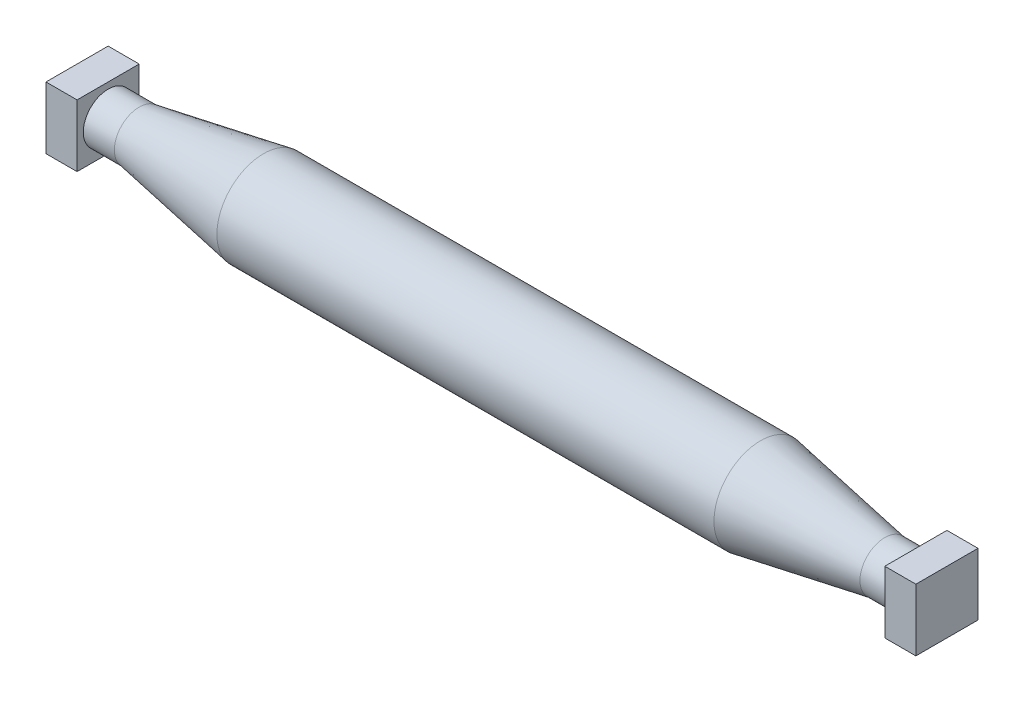
ISO-10303-21;
HEADER;
FILE_DESCRIPTION(('STEP AP214'),'2;1');
FILE_NAME('part.step','',(''),(''),'','','');
FILE_SCHEMA(('AUTOMOTIVE_DESIGN { 1 0 10303 214 1 1 1 1 }'));
ENDSEC;
DATA;
#1=APPLICATION_CONTEXT('core data for automotive mechanical design processes');
#2=APPLICATION_PROTOCOL_DEFINITION('international standard','automotive_design',2000,#1);
#3=PRODUCT_CONTEXT('',#1,'mechanical');
#4=PRODUCT('Part','Part','',(#3));
#5=PRODUCT_RELATED_PRODUCT_CATEGORY('part','',(#4));
#6=PRODUCT_DEFINITION_FORMATION('','',#4);
#7=PRODUCT_DEFINITION_CONTEXT('part definition',#1,'design');
#8=PRODUCT_DEFINITION('design','',#6,#7);
#9=PRODUCT_DEFINITION_SHAPE('','',#8);
#10=(LENGTH_UNIT() NAMED_UNIT(*) SI_UNIT(.MILLI.,.METRE.));
#11=(NAMED_UNIT(*) PLANE_ANGLE_UNIT() SI_UNIT($,.RADIAN.));
#12=(NAMED_UNIT(*) SI_UNIT($,.STERADIAN.) SOLID_ANGLE_UNIT());
#13=UNCERTAINTY_MEASURE_WITH_UNIT(LENGTH_MEASURE(1.E-05),#10,'distance_accuracy_value','');
#14=(GEOMETRIC_REPRESENTATION_CONTEXT(3) GLOBAL_UNCERTAINTY_ASSIGNED_CONTEXT((#13)) GLOBAL_UNIT_ASSIGNED_CONTEXT((#10,
#11,#12)) REPRESENTATION_CONTEXT('',''));
#15=CARTESIAN_POINT('',(0.,0.,0.));
#16=DIRECTION('',(0.,0.,1.));
#17=DIRECTION('',(1.,0.,0.));
#18=AXIS2_PLACEMENT_3D('',#15,#16,#17);
#19=CARTESIAN_POINT('',(0.,0.,0.));
#20=DIRECTION('',(-1.,0.,0.));
#21=DIRECTION('',(0.,-1.,0.));
#22=AXIS2_PLACEMENT_3D('',#19,#20,#21);
#23=CYLINDRICAL_SURFACE('',#22,19.05);
#24=CARTESIAN_POINT('',(101.6,0.,0.));
#25=DIRECTION('',(-1.,0.,0.));
#26=DIRECTION('',(0.,-1.,0.));
#27=AXIS2_PLACEMENT_3D('',#24,#25,#26);
#28=CIRCLE('',#27,19.05);
#29=CARTESIAN_POINT('',(101.6,-19.05,0.));
#30=VERTEX_POINT('',#29);
#31=EDGE_CURVE('E44',#30,#30,#28,.T.);
#32=ORIENTED_EDGE('',*,*,#31,.T.);
#33=EDGE_LOOP('',(#32));
#34=FACE_BOUND('',#33,.T.);
#35=CARTESIAN_POINT('',(-101.6,0.,0.));
#36=DIRECTION('',(-1.,0.,0.));
#37=DIRECTION('',(0.,-1.,0.));
#38=AXIS2_PLACEMENT_3D('',#35,#36,#37);
#39=CIRCLE('',#38,19.05);
#40=CARTESIAN_POINT('',(-101.6,-19.05,0.));
#41=VERTEX_POINT('',#40);
#42=EDGE_CURVE('E155',#41,#41,#39,.T.);
#43=ORIENTED_EDGE('',*,*,#42,.F.);
#44=EDGE_LOOP('',(#43));
#45=FACE_BOUND('',#44,.T.);
#46=ADVANCED_FACE('F35',(#34,#45),#23,.T.);
#47=CARTESIAN_POINT('',(0.,0.,0.));
#48=DIRECTION('',(-1.,0.,0.));
#49=DIRECTION('',(0.,-1.,0.));
#50=AXIS2_PLACEMENT_3D('',#47,#48,#49);
#51=CYLINDRICAL_SURFACE('',#50,10.16);
#52=CARTESIAN_POINT('',(165.1,0.,0.));
#53=DIRECTION('',(-1.,0.,0.));
#54=DIRECTION('',(0.,-1.,0.));
#55=AXIS2_PLACEMENT_3D('',#52,#53,#54);
#56=CIRCLE('',#55,10.16);
#57=CARTESIAN_POINT('',(165.1,-10.16,0.));
#58=VERTEX_POINT('',#57);
#59=EDGE_CURVE('E38',#58,#58,#56,.T.);
#60=ORIENTED_EDGE('',*,*,#59,.T.);
#61=EDGE_LOOP('',(#60));
#62=FACE_BOUND('',#61,.T.);
#63=CARTESIAN_POINT('',(152.4,0.,0.));
#64=DIRECTION('',(-1.,0.,0.));
#65=DIRECTION('',(0.,-1.,0.));
#66=AXIS2_PLACEMENT_3D('',#63,#64,#65);
#67=CIRCLE('',#66,10.16);
#68=CARTESIAN_POINT('',(152.4,-10.16,0.));
#69=VERTEX_POINT('',#68);
#70=EDGE_CURVE('E11',#69,#69,#67,.T.);
#71=ORIENTED_EDGE('',*,*,#70,.F.);
#72=EDGE_LOOP('',(#71));
#73=FACE_BOUND('',#72,.T.);
#74=ADVANCED_FACE('F190',(#62,#73),#51,.T.);
#75=CARTESIAN_POINT('',(101.6,0.,0.));
#76=DIRECTION('',(-1.,0.,0.));
#77=DIRECTION('',(0.,-1.,0.));
#78=AXIS2_PLACEMENT_3D('',#75,#76,#77);
#79=CONICAL_SURFACE('',#78,19.05,0.173245666452365);
#80=ORIENTED_EDGE('',*,*,#70,.T.);
#81=EDGE_LOOP('',(#80));
#82=FACE_BOUND('',#81,.T.);
#83=ORIENTED_EDGE('',*,*,#31,.F.);
#84=EDGE_LOOP('',(#83));
#85=FACE_BOUND('',#84,.T.);
#86=ADVANCED_FACE('F215',(#82,#85),#79,.T.);
#87=CARTESIAN_POINT('',(177.8,-12.7,-12.7));
#88=DIRECTION('',(0.,0.,1.));
#89=DIRECTION('',(1.,0.,0.));
#90=AXIS2_PLACEMENT_3D('',#87,#88,#89);
#91=PLANE('',#90);
#92=DIRECTION('',(0.,1.,0.));
#93=VECTOR('',#92,1.);
#94=CARTESIAN_POINT('',(165.1,-12.7,-12.7));
#95=LINE('',#94,#93);
#96=CARTESIAN_POINT('',(165.1,-12.7,-12.7));
#97=VERTEX_POINT('',#96);
#98=CARTESIAN_POINT('',(165.1,12.7,-12.7));
#99=VERTEX_POINT('',#98);
#100=EDGE_CURVE('E161',#97,#99,#95,.T.);
#101=ORIENTED_EDGE('',*,*,#100,.T.);
#102=DIRECTION('',(-1.,0.,0.));
#103=VECTOR('',#102,1.);
#104=CARTESIAN_POINT('',(177.8,12.7,-12.7));
#105=LINE('',#104,#103);
#106=CARTESIAN_POINT('',(177.8,12.7,-12.7));
#107=VERTEX_POINT('',#106);
#108=EDGE_CURVE('E182',#107,#99,#105,.T.);
#109=ORIENTED_EDGE('',*,*,#108,.F.);
#110=DIRECTION('',(0.,1.,0.));
#111=VECTOR('',#110,1.);
#112=CARTESIAN_POINT('',(177.8,-12.7,-12.7));
#113=LINE('',#112,#111);
#114=CARTESIAN_POINT('',(177.8,-12.7,-12.7));
#115=VERTEX_POINT('',#114);
#116=EDGE_CURVE('E164',#115,#107,#113,.T.);
#117=ORIENTED_EDGE('',*,*,#116,.F.);
#118=DIRECTION('',(-1.,0.,0.));
#119=VECTOR('',#118,1.);
#120=CARTESIAN_POINT('',(177.8,-12.7,-12.7));
#121=LINE('',#120,#119);
#122=EDGE_CURVE('E170',#115,#97,#121,.T.);
#123=ORIENTED_EDGE('',*,*,#122,.T.);
#124=EDGE_LOOP('',(#101,#109,#117,#123));
#125=FACE_BOUND('',#124,.T.);
#126=ADVANCED_FACE('F202',(#125),#91,.F.);
#127=CARTESIAN_POINT('',(177.8,12.7,12.7));
#128=DIRECTION('',(0.,-1.,0.));
#129=DIRECTION('',(1.,0.,0.));
#130=AXIS2_PLACEMENT_3D('',#127,#128,#129);
#131=PLANE('',#130);
#132=DIRECTION('',(0.,0.,1.));
#133=VECTOR('',#132,1.);
#134=CARTESIAN_POINT('',(165.1,12.7,12.7));
#135=LINE('',#134,#133);
#136=CARTESIAN_POINT('',(165.1,12.7,12.7));
#137=VERTEX_POINT('',#136);
#138=EDGE_CURVE('E173',#99,#137,#135,.T.);
#139=ORIENTED_EDGE('',*,*,#138,.T.);
#140=DIRECTION('',(-1.,0.,0.));
#141=VECTOR('',#140,1.);
#142=CARTESIAN_POINT('',(177.8,12.7,12.7));
#143=LINE('',#142,#141);
#144=CARTESIAN_POINT('',(177.8,12.7,12.7));
#145=VERTEX_POINT('',#144);
#146=EDGE_CURVE('E180',#145,#137,#143,.T.);
#147=ORIENTED_EDGE('',*,*,#146,.F.);
#148=DIRECTION('',(0.,0.,1.));
#149=VECTOR('',#148,1.);
#150=CARTESIAN_POINT('',(177.8,12.7,12.7));
#151=LINE('',#150,#149);
#152=EDGE_CURVE('E84',#107,#145,#151,.T.);
#153=ORIENTED_EDGE('',*,*,#152,.F.);
#154=ORIENTED_EDGE('',*,*,#108,.T.);
#155=EDGE_LOOP('',(#139,#147,#153,#154));
#156=FACE_BOUND('',#155,.T.);
#157=ADVANCED_FACE('F207',(#156),#131,.F.);
#158=CARTESIAN_POINT('',(177.8,-12.7,12.7));
#159=DIRECTION('',(0.,0.,-1.));
#160=DIRECTION('',(-1.,0.,0.));
#161=AXIS2_PLACEMENT_3D('',#158,#159,#160);
#162=PLANE('',#161);
#163=DIRECTION('',(0.,-1.,0.));
#164=VECTOR('',#163,1.);
#165=CARTESIAN_POINT('',(165.1,-12.7,12.7));
#166=LINE('',#165,#164);
#167=CARTESIAN_POINT('',(165.1,-12.7,12.7));
#168=VERTEX_POINT('',#167);
#169=EDGE_CURVE('E70',#137,#168,#166,.T.);
#170=ORIENTED_EDGE('',*,*,#169,.T.);
#171=DIRECTION('',(-1.,0.,0.));
#172=VECTOR('',#171,1.);
#173=CARTESIAN_POINT('',(177.8,-12.7,12.7));
#174=LINE('',#173,#172);
#175=CARTESIAN_POINT('',(177.8,-12.7,12.7));
#176=VERTEX_POINT('',#175);
#177=EDGE_CURVE('E178',#176,#168,#174,.T.);
#178=ORIENTED_EDGE('',*,*,#177,.F.);
#179=DIRECTION('',(0.,-1.,0.));
#180=VECTOR('',#179,1.);
#181=CARTESIAN_POINT('',(177.8,-12.7,12.7));
#182=LINE('',#181,#180);
#183=EDGE_CURVE('E167',#145,#176,#182,.T.);
#184=ORIENTED_EDGE('',*,*,#183,.F.);
#185=ORIENTED_EDGE('',*,*,#146,.T.);
#186=EDGE_LOOP('',(#170,#178,#184,#185));
#187=FACE_BOUND('',#186,.T.);
#188=ADVANCED_FACE('F206',(#187),#162,.F.);
#189=CARTESIAN_POINT('',(177.8,-12.7,12.7));
#190=DIRECTION('',(0.,1.,0.));
#191=DIRECTION('',(-1.,0.,0.));
#192=AXIS2_PLACEMENT_3D('',#189,#190,#191);
#193=PLANE('',#192);
#194=DIRECTION('',(0.,0.,-1.));
#195=VECTOR('',#194,1.);
#196=CARTESIAN_POINT('',(165.1,-12.7,12.7));
#197=LINE('',#196,#195);
#198=EDGE_CURVE('E76',#168,#97,#197,.T.);
#199=ORIENTED_EDGE('',*,*,#198,.T.);
#200=ORIENTED_EDGE('',*,*,#122,.F.);
#201=DIRECTION('',(0.,0.,-1.));
#202=VECTOR('',#201,1.);
#203=CARTESIAN_POINT('',(177.8,-12.7,12.7));
#204=LINE('',#203,#202);
#205=EDGE_CURVE('E52',#176,#115,#204,.T.);
#206=ORIENTED_EDGE('',*,*,#205,.F.);
#207=ORIENTED_EDGE('',*,*,#177,.T.);
#208=EDGE_LOOP('',(#199,#200,#206,#207));
#209=FACE_BOUND('',#208,.T.);
#210=ADVANCED_FACE('F204',(#209),#193,.F.);
#211=CARTESIAN_POINT('',(177.8,0.,0.));
#212=DIRECTION('',(-1.,0.,0.));
#213=DIRECTION('',(0.,0.,1.));
#214=AXIS2_PLACEMENT_3D('',#211,#212,#213);
#215=PLANE('',#214);
#216=ORIENTED_EDGE('',*,*,#116,.T.);
#217=ORIENTED_EDGE('',*,*,#152,.T.);
#218=ORIENTED_EDGE('',*,*,#183,.T.);
#219=ORIENTED_EDGE('',*,*,#205,.T.);
#220=EDGE_LOOP('',(#216,#217,#218,#219));
#221=FACE_BOUND('',#220,.T.);
#222=ADVANCED_FACE('F197',(#221),#215,.F.);
#223=CARTESIAN_POINT('',(165.1,0.,0.));
#224=DIRECTION('',(-1.,0.,0.));
#225=DIRECTION('',(0.,0.,1.));
#226=AXIS2_PLACEMENT_3D('',#223,#224,#225);
#227=PLANE('',#226);
#228=ORIENTED_EDGE('',*,*,#59,.F.);
#229=EDGE_LOOP('',(#228));
#230=FACE_BOUND('',#229,.T.);
#231=ORIENTED_EDGE('',*,*,#100,.F.);
#232=ORIENTED_EDGE('',*,*,#198,.F.);
#233=ORIENTED_EDGE('',*,*,#169,.F.);
#234=ORIENTED_EDGE('',*,*,#138,.F.);
#235=EDGE_LOOP('',(#231,#232,#233,#234));
#236=FACE_BOUND('',#235,.T.);
#237=ADVANCED_FACE('F193',(#230,#236),#227,.T.);
#238=CARTESIAN_POINT('',(0.,0.,0.));
#239=DIRECTION('',(1.,0.,0.));
#240=DIRECTION('',(0.,-1.,0.));
#241=AXIS2_PLACEMENT_3D('',#238,#239,#240);
#242=CYLINDRICAL_SURFACE('',#241,10.16);
#243=CARTESIAN_POINT('',(-165.1,0.,0.));
#244=DIRECTION('',(-1.,0.,0.));
#245=DIRECTION('',(0.,-1.,0.));
#246=AXIS2_PLACEMENT_3D('',#243,#244,#245);
#247=CIRCLE('',#246,10.16);
#248=CARTESIAN_POINT('',(-165.1,-10.16,0.));
#249=VERTEX_POINT('',#248);
#250=EDGE_CURVE('E131',#249,#249,#247,.T.);
#251=ORIENTED_EDGE('',*,*,#250,.F.);
#252=EDGE_LOOP('',(#251));
#253=FACE_BOUND('',#252,.T.);
#254=CARTESIAN_POINT('',(-152.4,0.,0.));
#255=DIRECTION('',(-1.,0.,0.));
#256=DIRECTION('',(0.,-1.,0.));
#257=AXIS2_PLACEMENT_3D('',#254,#255,#256);
#258=CIRCLE('',#257,10.16);
#259=CARTESIAN_POINT('',(-152.4,-10.16,0.));
#260=VERTEX_POINT('',#259);
#261=EDGE_CURVE('E158',#260,#260,#258,.T.);
#262=ORIENTED_EDGE('',*,*,#261,.T.);
#263=EDGE_LOOP('',(#262));
#264=FACE_BOUND('',#263,.T.);
#265=ADVANCED_FACE('F196',(#253,#264),#242,.T.);
#266=CARTESIAN_POINT('',(-101.6,0.,0.));
#267=DIRECTION('',(1.,0.,0.));
#268=DIRECTION('',(0.,-1.,0.));
#269=AXIS2_PLACEMENT_3D('',#266,#267,#268);
#270=CONICAL_SURFACE('',#269,19.05,0.173245666452365);
#271=ORIENTED_EDGE('',*,*,#261,.F.);
#272=EDGE_LOOP('',(#271));
#273=FACE_BOUND('',#272,.T.);
#274=ORIENTED_EDGE('',*,*,#42,.T.);
#275=EDGE_LOOP('',(#274));
#276=FACE_BOUND('',#275,.T.);
#277=ADVANCED_FACE('F224',(#273,#276),#270,.T.);
#278=CARTESIAN_POINT('',(-177.8,-12.7,-12.7));
#279=DIRECTION('',(0.,0.,1.));
#280=DIRECTION('',(-1.,0.,0.));
#281=AXIS2_PLACEMENT_3D('',#278,#279,#280);
#282=PLANE('',#281);
#283=DIRECTION('',(0.,1.,0.));
#284=VECTOR('',#283,1.);
#285=CARTESIAN_POINT('',(-165.1,-12.7,-12.7));
#286=LINE('',#285,#284);
#287=CARTESIAN_POINT('',(-165.1,-12.7,-12.7));
#288=VERTEX_POINT('',#287);
#289=CARTESIAN_POINT('',(-165.1,12.7,-12.7));
#290=VERTEX_POINT('',#289);
#291=EDGE_CURVE('E145',#288,#290,#286,.T.);
#292=ORIENTED_EDGE('',*,*,#291,.F.);
#293=DIRECTION('',(1.,0.,0.));
#294=VECTOR('',#293,1.);
#295=CARTESIAN_POINT('',(-177.8,-12.7,-12.7));
#296=LINE('',#295,#294);
#297=CARTESIAN_POINT('',(-177.8,-12.7,-12.7));
#298=VERTEX_POINT('',#297);
#299=EDGE_CURVE('E136',#298,#288,#296,.T.);
#300=ORIENTED_EDGE('',*,*,#299,.F.);
#301=DIRECTION('',(0.,1.,0.));
#302=VECTOR('',#301,1.);
#303=CARTESIAN_POINT('',(-177.8,-12.7,-12.7));
#304=LINE('',#303,#302);
#305=CARTESIAN_POINT('',(-177.8,12.7,-12.7));
#306=VERTEX_POINT('',#305);
#307=EDGE_CURVE('E115',#298,#306,#304,.T.);
#308=ORIENTED_EDGE('',*,*,#307,.T.);
#309=DIRECTION('',(1.,0.,0.));
#310=VECTOR('',#309,1.);
#311=CARTESIAN_POINT('',(-177.8,12.7,-12.7));
#312=LINE('',#311,#310);
#313=EDGE_CURVE('E124',#306,#290,#312,.T.);
#314=ORIENTED_EDGE('',*,*,#313,.T.);
#315=EDGE_LOOP('',(#292,#300,#308,#314));
#316=FACE_BOUND('',#315,.T.);
#317=ADVANCED_FACE('F134',(#316),#282,.F.);
#318=CARTESIAN_POINT('',(-177.8,12.7,12.7));
#319=DIRECTION('',(0.,-1.,0.));
#320=DIRECTION('',(-1.,0.,0.));
#321=AXIS2_PLACEMENT_3D('',#318,#319,#320);
#322=PLANE('',#321);
#323=DIRECTION('',(0.,0.,1.));
#324=VECTOR('',#323,1.);
#325=CARTESIAN_POINT('',(-165.1,12.7,12.7));
#326=LINE('',#325,#324);
#327=CARTESIAN_POINT('',(-165.1,12.7,12.7));
#328=VERTEX_POINT('',#327);
#329=EDGE_CURVE('E127',#290,#328,#326,.T.);
#330=ORIENTED_EDGE('',*,*,#329,.F.);
#331=ORIENTED_EDGE('',*,*,#313,.F.);
#332=DIRECTION('',(0.,0.,1.));
#333=VECTOR('',#332,1.);
#334=CARTESIAN_POINT('',(-177.8,12.7,12.7));
#335=LINE('',#334,#333);
#336=CARTESIAN_POINT('',(-177.8,12.7,12.7));
#337=VERTEX_POINT('',#336);
#338=EDGE_CURVE('E111',#306,#337,#335,.T.);
#339=ORIENTED_EDGE('',*,*,#338,.T.);
#340=DIRECTION('',(1.,0.,0.));
#341=VECTOR('',#340,1.);
#342=CARTESIAN_POINT('',(-177.8,12.7,12.7));
#343=LINE('',#342,#341);
#344=EDGE_CURVE('E132',#337,#328,#343,.T.);
#345=ORIENTED_EDGE('',*,*,#344,.T.);
#346=EDGE_LOOP('',(#330,#331,#339,#345));
#347=FACE_BOUND('',#346,.T.);
#348=ADVANCED_FACE('F125',(#347),#322,.F.);
#349=CARTESIAN_POINT('',(-177.8,-12.7,12.7));
#350=DIRECTION('',(0.,0.,-1.));
#351=DIRECTION('',(1.,0.,0.));
#352=AXIS2_PLACEMENT_3D('',#349,#350,#351);
#353=PLANE('',#352);
#354=DIRECTION('',(0.,-1.,0.));
#355=VECTOR('',#354,1.);
#356=CARTESIAN_POINT('',(-165.1,-12.7,12.7));
#357=LINE('',#356,#355);
#358=CARTESIAN_POINT('',(-165.1,-12.7,12.7));
#359=VERTEX_POINT('',#358);
#360=EDGE_CURVE('E139',#328,#359,#357,.T.);
#361=ORIENTED_EDGE('',*,*,#360,.F.);
#362=ORIENTED_EDGE('',*,*,#344,.F.);
#363=DIRECTION('',(0.,-1.,0.));
#364=VECTOR('',#363,1.);
#365=CARTESIAN_POINT('',(-177.8,-12.7,12.7));
#366=LINE('',#365,#364);
#367=CARTESIAN_POINT('',(-177.8,-12.7,12.7));
#368=VERTEX_POINT('',#367);
#369=EDGE_CURVE('E118',#337,#368,#366,.T.);
#370=ORIENTED_EDGE('',*,*,#369,.T.);
#371=DIRECTION('',(1.,0.,0.));
#372=VECTOR('',#371,1.);
#373=CARTESIAN_POINT('',(-177.8,-12.7,12.7));
#374=LINE('',#373,#372);
#375=EDGE_CURVE('E151',#368,#359,#374,.T.);
#376=ORIENTED_EDGE('',*,*,#375,.T.);
#377=EDGE_LOOP('',(#361,#362,#370,#376));
#378=FACE_BOUND('',#377,.T.);
#379=ADVANCED_FACE('F282',(#378),#353,.F.);
#380=CARTESIAN_POINT('',(-177.8,-12.7,12.7));
#381=DIRECTION('',(0.,1.,0.));
#382=DIRECTION('',(1.,0.,0.));
#383=AXIS2_PLACEMENT_3D('',#380,#381,#382);
#384=PLANE('',#383);
#385=DIRECTION('',(0.,0.,-1.));
#386=VECTOR('',#385,1.);
#387=CARTESIAN_POINT('',(-165.1,-12.7,12.7));
#388=LINE('',#387,#386);
#389=EDGE_CURVE('E137',#359,#288,#388,.T.);
#390=ORIENTED_EDGE('',*,*,#389,.F.);
#391=ORIENTED_EDGE('',*,*,#375,.F.);
#392=DIRECTION('',(0.,0.,-1.));
#393=VECTOR('',#392,1.);
#394=CARTESIAN_POINT('',(-177.8,-12.7,12.7));
#395=LINE('',#394,#393);
#396=EDGE_CURVE('E143',#368,#298,#395,.T.);
#397=ORIENTED_EDGE('',*,*,#396,.T.);
#398=ORIENTED_EDGE('',*,*,#299,.T.);
#399=EDGE_LOOP('',(#390,#391,#397,#398));
#400=FACE_BOUND('',#399,.T.);
#401=ADVANCED_FACE('F290',(#400),#384,.F.);
#402=CARTESIAN_POINT('',(-177.8,0.,0.));
#403=DIRECTION('',(1.,0.,0.));
#404=DIRECTION('',(0.,0.,1.));
#405=AXIS2_PLACEMENT_3D('',#402,#403,#404);
#406=PLANE('',#405);
#407=ORIENTED_EDGE('',*,*,#307,.F.);
#408=ORIENTED_EDGE('',*,*,#396,.F.);
#409=ORIENTED_EDGE('',*,*,#369,.F.);
#410=ORIENTED_EDGE('',*,*,#338,.F.);
#411=EDGE_LOOP('',(#407,#408,#409,#410));
#412=FACE_BOUND('',#411,.T.);
#413=ADVANCED_FACE('F113',(#412),#406,.F.);
#414=CARTESIAN_POINT('',(-165.1,0.,0.));
#415=DIRECTION('',(1.,0.,0.));
#416=DIRECTION('',(0.,0.,1.));
#417=AXIS2_PLACEMENT_3D('',#414,#415,#416);
#418=PLANE('',#417);
#419=ORIENTED_EDGE('',*,*,#250,.T.);
#420=EDGE_LOOP('',(#419));
#421=FACE_BOUND('',#420,.T.);
#422=ORIENTED_EDGE('',*,*,#291,.T.);
#423=ORIENTED_EDGE('',*,*,#329,.T.);
#424=ORIENTED_EDGE('',*,*,#360,.T.);
#425=ORIENTED_EDGE('',*,*,#389,.T.);
#426=EDGE_LOOP('',(#422,#423,#424,#425));
#427=FACE_BOUND('',#426,.T.);
#428=ADVANCED_FACE('F309',(#421,#427),#418,.T.);
#429=CLOSED_SHELL('',(#46,#74,#86,#126,#157,#188,#210,#222,#237,#265,#277,#317,#348,#379,#401,
#413,#428));
#430=MANIFOLD_SOLID_BREP('B2',#429);
#431=ADVANCED_BREP_SHAPE_REPRESENTATION('',(#18,#430),#14);
#432=SHAPE_DEFINITION_REPRESENTATION(#9,#431);
ENDSEC;
END-ISO-10303-21;
